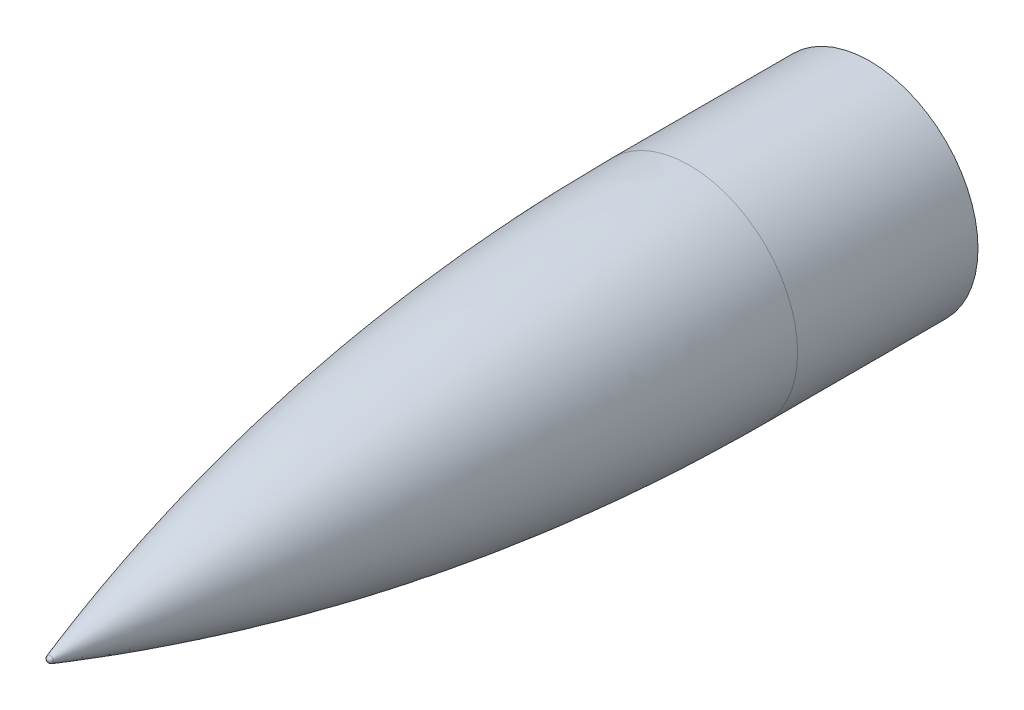
ISO-10303-21;
HEADER;
FILE_DESCRIPTION(('STEP AP214'),'2;1');
FILE_NAME('part.step','',(''),(''),'','','');
FILE_SCHEMA(('AUTOMOTIVE_DESIGN { 1 0 10303 214 1 1 1 1 }'));
ENDSEC;
DATA;
#1=APPLICATION_CONTEXT('core data for automotive mechanical design processes');
#2=APPLICATION_PROTOCOL_DEFINITION('international standard','automotive_design',2000,#1);
#3=PRODUCT_CONTEXT('',#1,'mechanical');
#4=PRODUCT('Part','Part','',(#3));
#5=PRODUCT_RELATED_PRODUCT_CATEGORY('part','',(#4));
#6=PRODUCT_DEFINITION_FORMATION('','',#4);
#7=PRODUCT_DEFINITION_CONTEXT('part definition',#1,'design');
#8=PRODUCT_DEFINITION('design','',#6,#7);
#9=PRODUCT_DEFINITION_SHAPE('','',#8);
#10=(LENGTH_UNIT() NAMED_UNIT(*) SI_UNIT(.MILLI.,.METRE.));
#11=(NAMED_UNIT(*) PLANE_ANGLE_UNIT() SI_UNIT($,.RADIAN.));
#12=(NAMED_UNIT(*) SI_UNIT($,.STERADIAN.) SOLID_ANGLE_UNIT());
#13=UNCERTAINTY_MEASURE_WITH_UNIT(LENGTH_MEASURE(1.E-05),#10,'distance_accuracy_value','');
#14=(GEOMETRIC_REPRESENTATION_CONTEXT(3) GLOBAL_UNCERTAINTY_ASSIGNED_CONTEXT((#13)) GLOBAL_UNIT_ASSIGNED_CONTEXT((#10,
#11,#12)) REPRESENTATION_CONTEXT('',''));
#15=CARTESIAN_POINT('',(0.,0.,0.));
#16=DIRECTION('',(0.,0.,1.));
#17=DIRECTION('',(1.,0.,0.));
#18=AXIS2_PLACEMENT_3D('',#15,#16,#17);
#19=CARTESIAN_POINT('',(0.,76.2,-457.200000002003));
#20=CARTESIAN_POINT('',(0.,76.2000000000013,-456.548437388614));
#21=CARTESIAN_POINT('',(0.,76.1988487515469,-455.224645405296));
#22=CARTESIAN_POINT('',(0.,76.1936681334763,-452.273254041734));
#23=CARTESIAN_POINT('',(0.,76.1798531857848,-449.518892815122));
#24=CARTESIAN_POINT('',(0.,76.1591308488753,-446.212842428947));
#25=CARTESIAN_POINT('',(0.,76.1315012242696,-443.195852678786));
#26=CARTESIAN_POINT('',(0.,76.0969644473622,-440.014908087773));
#27=CARTESIAN_POINT('',(0.,76.0555206873753,-436.932091662695));
#28=CARTESIAN_POINT('',(0.,76.0130809713583,-434.170942410348));
#29=CARTESIAN_POINT('',(0.,75.9721846913015,-431.824783137392));
#30=CARTESIAN_POINT('',(0.,75.9274482451638,-429.445821311586));
#31=CARTESIAN_POINT('',(0.,75.8787816653814,-427.056740621366));
#32=CARTESIAN_POINT('',(0.,75.8167443414444,-424.265722802822));
#33=CARTESIAN_POINT('',(0.,75.7191035079294,-420.281047098389));
#34=CARTESIAN_POINT('',(0.,75.5875095712179,-415.498770122787));
#35=CARTESIAN_POINT('',(0.,75.4129488569202,-409.920648505655));
#36=CARTESIAN_POINT('',(0.,75.1846077295176,-403.546288387086));
#37=CARTESIAN_POINT('',(0.,74.8631332036689,-395.579894234045));
#38=CARTESIAN_POINT('',(0.,74.4196973159423,-386.022582596854));
#39=CARTESIAN_POINT('',(0.,73.8182841467632,-374.876603063499));
#40=CARTESIAN_POINT('',(0.,73.116034664959,-363.736483149294));
#41=CARTESIAN_POINT('',(0.,72.4421216750033,-354.192695831643));
#42=CARTESIAN_POINT('',(0.,71.7106489758083,-344.653176693014));
#43=CARTESIAN_POINT('',(0.,70.6586323805303,-331.939887808178));
#44=CARTESIAN_POINT('',(0.,68.4345036189141,-308.124044325305));
#45=CARTESIAN_POINT('',(0.,64.0717726481179,-270.098689839589));
#46=CARTESIAN_POINT('',(0.,56.5749250206996,-219.611508638507));
#47=CARTESIAN_POINT('',(0.,46.9526973943196,-169.482674091511));
#48=CARTESIAN_POINT('',(0.,36.9529785020963,-125.960463946544));
#49=CARTESIAN_POINT('',(0.,29.3692979323379,-96.626245011931));
#50=CARTESIAN_POINT('',(0.,25.1688101871788,-81.2432191690299));
#51=CARTESIAN_POINT('',(0.,22.1312200759449,-70.5023957766314));
#52=CARTESIAN_POINT('',(0.,20.3676954106876,-64.3726795622016));
#53=CARTESIAN_POINT('',(0.,18.5764655166775,-58.2510381183602));
#54=CARTESIAN_POINT('',(0.,16.7575370180256,-52.1375075875943));
#55=CARTESIAN_POINT('',(0.,15.1418183973602,-46.7955159382312));
#56=CARTESIAN_POINT('',(0.,13.7396143813749,-42.2217799753733));
#57=CARTESIAN_POINT('',(0.,12.5597002020987,-38.4141143017726));
#58=CARTESIAN_POINT('',(0.,11.608736298264,-35.3696993818387));
#59=CARTESIAN_POINT('',(0.,10.6563392263899,-32.3446952832243));
#60=CARTESIAN_POINT('',(0.,9.70180303137446,-29.3366042170158));
#61=CARTESIAN_POINT('',(0.,8.74673359747482,-26.3497921731395));
#62=CARTESIAN_POINT('',(0.,7.78866587876439,-23.3765454950944));
#63=CARTESIAN_POINT('',(0.,6.82702545396152,-20.414326971786));
#64=CARTESIAN_POINT('',(0.,5.97452219610879,-17.8084654715785));
#65=CARTESIAN_POINT('',(0.,5.24985598501819,-15.6063486258237));
#66=CARTESIAN_POINT('',(0.,4.49596548332437,-13.3283133391583));
#67=CARTESIAN_POINT('',(0.,3.83224313186542,-11.3287047626376));
#68=CARTESIAN_POINT('',(0.,3.03797171475087,-8.95786415416549));
#69=CARTESIAN_POINT('',(0.,2.61508418574476,-7.69916980576836));
#70=CARTESIAN_POINT('',(0.,2.40703971104895,-7.08171415675308));
#71=B_SPLINE_CURVE_WITH_KNOTS('',4,(#19,#20,#21,#22,#23,#24,#25,#26,#27,#28,#29,#30,#31,#32,#33,
#34,#35,#36,#37,#38,#39,#40,#41,#42,#43,#44,#45,#46,#47,#48,#49,#50,#51,#52,#53,#54,#55,#56,#57,
#58,#59,#60,#61,#62,#63,#64,#65,#66,#67,#68,#69,#70),.UNSPECIFIED.,.F.,.F.,(5,1,1,1,1,1,1,1,1,1,
1,1,1,1,1,1,1,1,1,1,1,1,1,1,1,1,1,1,1,1,1,1,1,1,1,1,1,1,1,1,1,1,1,1,1,1,1,1,5),
(0.0827239701774689,0.088412727435298,0.0941014846931273,0.0997902419509565,0.105478999208786,
0.111167756466615,0.116856513724444,0.122545270982273,0.128234028240102,0.13114099710237,
0.134047965964638,0.139861903689174,0.14567584141371,0.151489779138246,0.163117654587318,
0.174745530036389,0.186373405395934,0.198001280755479,0.221257031474569,0.244512782167707,
0.267768532860844,0.279396408271968,0.291024283683092,0.31428003450534,0.360791536858348,
0.453814539068168,0.570093292661288,0.686372046216202,0.732883552137953,0.77939505384661,
0.791022929475281,0.802650805103951,0.814278680732622,0.825906556361293,0.837534431011353,
0.849162305661413,0.854976242986443,0.860790180311473,0.866604117636504,0.872418054961534,
0.878106813179139,0.883795571396744,0.889484329614349,0.895173087831954,0.900861846049559,
0.903706225158361,0.906550604267164,0.912239362484769,0.917928120702374),.UNSPECIFIED.);
#72=CARTESIAN_POINT('',(0.,0.,-480.059999999982));
#73=DIRECTION('',(0.,0.,-1.));
#74=AXIS1_PLACEMENT('',#72,#73);
#75=SURFACE_OF_REVOLUTION('',#71,#74);
#76=CARTESIAN_POINT('',(0.,0.,-7.08171415696418));
#77=DIRECTION('',(0.,0.,-1.));
#78=DIRECTION('',(-1.,0.,0.));
#79=AXIS2_PLACEMENT_3D('',#76,#77,#78);
#80=CIRCLE('',#79,2.40703971111992);
#81=CARTESIAN_POINT('',(-2.40703971111992,0.,-7.08171415696418));
#82=VERTEX_POINT('',#81);
#83=EDGE_CURVE('E10',#82,#82,#80,.T.);
#84=ORIENTED_EDGE('',*,*,#83,.T.);
#85=EDGE_LOOP('',(#84));
#86=FACE_BOUND('',#85,.T.);
#87=CARTESIAN_POINT('',(0.,0.,-457.200000001001));
#88=DIRECTION('',(0.,0.,-1.));
#89=DIRECTION('',(-1.,0.,0.));
#90=AXIS2_PLACEMENT_3D('',#87,#88,#89);
#91=CIRCLE('',#90,76.2);
#92=CARTESIAN_POINT('',(-76.2,0.,-457.200000001001));
#93=VERTEX_POINT('',#92);
#94=EDGE_CURVE('E47',#93,#93,#91,.T.);
#95=ORIENTED_EDGE('',*,*,#94,.F.);
#96=EDGE_LOOP('',(#95));
#97=FACE_BOUND('',#96,.T.);
#98=ADVANCED_FACE('F39',(#86,#97),#75,.F.);
#99=CARTESIAN_POINT('',(0.,-7.08043967053172E-11,-7.89273809542197));
#100=DIRECTION('',(0.,0.,-1.));
#101=DIRECTION('',(0.,1.,0.));
#102=AXIS2_PLACEMENT_3D('',#99,#100,#101);
#103=SPHERICAL_SURFACE('',#102,2.54000000000014);
#104=ORIENTED_EDGE('',*,*,#83,.F.);
#105=EDGE_LOOP('',(#104));
#106=FACE_BOUND('',#105,.T.);
#107=ADVANCED_FACE('F70',(#106),#103,.T.);
#108=CARTESIAN_POINT('',(0.,0.,-584.200000001001));
#109=DIRECTION('',(0.,0.,1.));
#110=DIRECTION('',(1.,0.,0.));
#111=AXIS2_PLACEMENT_3D('',#108,#109,#110);
#112=CYLINDRICAL_SURFACE('',#111,76.2);
#113=CARTESIAN_POINT('',(0.,0.,-584.200000001001));
#114=DIRECTION('',(0.,0.,-1.));
#115=DIRECTION('',(-1.,0.,0.));
#116=AXIS2_PLACEMENT_3D('',#113,#114,#115);
#117=CIRCLE('',#116,76.2);
#118=CARTESIAN_POINT('',(-76.2,0.,-584.200000001001));
#119=VERTEX_POINT('',#118);
#120=EDGE_CURVE('E52',#119,#119,#117,.T.);
#121=ORIENTED_EDGE('',*,*,#120,.F.);
#122=EDGE_LOOP('',(#121));
#123=FACE_BOUND('',#122,.T.);
#124=ORIENTED_EDGE('',*,*,#94,.T.);
#125=EDGE_LOOP('',(#124));
#126=FACE_BOUND('',#125,.T.);
#127=ADVANCED_FACE('F68',(#123,#126),#112,.T.);
#128=CARTESIAN_POINT('',(0.,0.,-584.200000001001));
#129=DIRECTION('',(0.,0.,-1.));
#130=DIRECTION('',(-1.,0.,0.));
#131=AXIS2_PLACEMENT_3D('',#128,#129,#130);
#132=PLANE('',#131);
#133=ORIENTED_EDGE('',*,*,#120,.T.);
#134=EDGE_LOOP('',(#133));
#135=FACE_BOUND('',#134,.T.);
#136=ADVANCED_FACE('F66',(#135),#132,.T.);
#137=CLOSED_SHELL('',(#98,#107,#127,#136));
#138=MANIFOLD_SOLID_BREP('B2',#137);
#139=ADVANCED_BREP_SHAPE_REPRESENTATION('',(#18,#138),#14);
#140=SHAPE_DEFINITION_REPRESENTATION(#9,#139);
ENDSEC;
END-ISO-10303-21;
